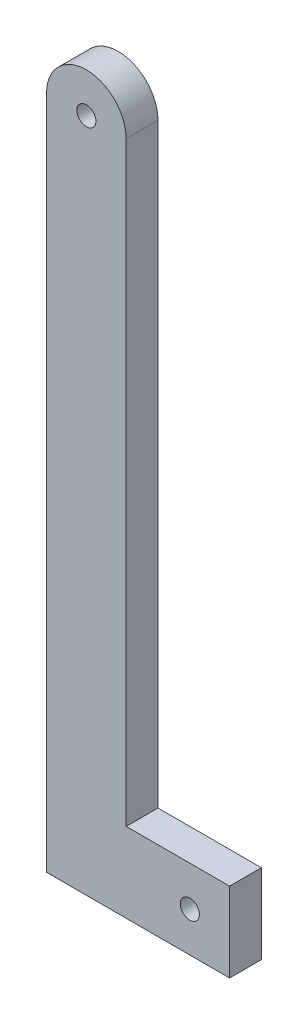
ISO-10303-21;
HEADER;
FILE_DESCRIPTION(('STEP AP214'),'2;1');
FILE_NAME('part.step','',(''),(''),'','','');
FILE_SCHEMA(('AUTOMOTIVE_DESIGN { 1 0 10303 214 1 1 1 1 }'));
ENDSEC;
DATA;
#1=APPLICATION_CONTEXT('core data for automotive mechanical design processes');
#2=APPLICATION_PROTOCOL_DEFINITION('international standard','automotive_design',2000,#1);
#3=PRODUCT_CONTEXT('',#1,'mechanical');
#4=PRODUCT('Part','Part','',(#3));
#5=PRODUCT_RELATED_PRODUCT_CATEGORY('part','',(#4));
#6=PRODUCT_DEFINITION_FORMATION('','',#4);
#7=PRODUCT_DEFINITION_CONTEXT('part definition',#1,'design');
#8=PRODUCT_DEFINITION('design','',#6,#7);
#9=PRODUCT_DEFINITION_SHAPE('','',#8);
#10=(LENGTH_UNIT() NAMED_UNIT(*) SI_UNIT(.MILLI.,.METRE.));
#11=(NAMED_UNIT(*) PLANE_ANGLE_UNIT() SI_UNIT($,.RADIAN.));
#12=(NAMED_UNIT(*) SI_UNIT($,.STERADIAN.) SOLID_ANGLE_UNIT());
#13=UNCERTAINTY_MEASURE_WITH_UNIT(LENGTH_MEASURE(1.E-05),#10,'distance_accuracy_value','');
#14=(GEOMETRIC_REPRESENTATION_CONTEXT(3) GLOBAL_UNCERTAINTY_ASSIGNED_CONTEXT((#13)) GLOBAL_UNIT_ASSIGNED_CONTEXT((#10,
#11,#12)) REPRESENTATION_CONTEXT('',''));
#15=CARTESIAN_POINT('',(0.,0.,0.));
#16=DIRECTION('',(0.,0.,1.));
#17=DIRECTION('',(1.,0.,0.));
#18=AXIS2_PLACEMENT_3D('',#15,#16,#17);
#19=CARTESIAN_POINT('',(0.,0.,10.));
#20=DIRECTION('',(0.,0.,1.));
#21=DIRECTION('',(1.,0.,0.));
#22=AXIS2_PLACEMENT_3D('',#19,#20,#21);
#23=PLANE('',#22);
#24=CARTESIAN_POINT('',(0.,0.,10.));
#25=DIRECTION('',(0.,0.,1.));
#26=DIRECTION('',(1.,0.,0.));
#27=AXIS2_PLACEMENT_3D('',#24,#25,#26);
#28=CIRCLE('',#27,3.);
#29=CARTESIAN_POINT('',(3.,0.,10.));
#30=VERTEX_POINT('',#29);
#31=EDGE_CURVE('E121',#30,#30,#28,.T.);
#32=ORIENTED_EDGE('',*,*,#31,.F.);
#33=EDGE_LOOP('',(#32));
#34=FACE_BOUND('',#33,.T.);
#35=CARTESIAN_POINT('',(0.,0.,10.));
#36=DIRECTION('',(0.,0.,1.));
#37=DIRECTION('',(1.,0.,0.));
#38=AXIS2_PLACEMENT_3D('',#35,#36,#37);
#39=CIRCLE('',#38,12.5);
#40=CARTESIAN_POINT('',(12.5,0.,10.));
#41=VERTEX_POINT('',#40);
#42=CARTESIAN_POINT('',(-12.5,0.,10.));
#43=VERTEX_POINT('',#42);
#44=EDGE_CURVE('E128',#41,#43,#39,.T.);
#45=ORIENTED_EDGE('',*,*,#44,.T.);
#46=DIRECTION('',(0.,-1.,0.));
#47=VECTOR('',#46,1.);
#48=CARTESIAN_POINT('',(-12.5,0.,10.));
#49=LINE('',#48,#47);
#50=CARTESIAN_POINT('',(-12.5,-212.108992783391,10.));
#51=VERTEX_POINT('',#50);
#52=EDGE_CURVE('E86',#43,#51,#49,.T.);
#53=ORIENTED_EDGE('',*,*,#52,.T.);
#54=DIRECTION('',(1.,0.,0.));
#55=VECTOR('',#54,1.);
#56=CARTESIAN_POINT('',(-12.5,-212.108992783391,10.));
#57=LINE('',#56,#55);
#58=CARTESIAN_POINT('',(45.,-212.108992783391,10.));
#59=VERTEX_POINT('',#58);
#60=EDGE_CURVE('E99',#51,#59,#57,.T.);
#61=ORIENTED_EDGE('',*,*,#60,.T.);
#62=DIRECTION('',(0.,1.,0.));
#63=VECTOR('',#62,1.);
#64=CARTESIAN_POINT('',(45.,-212.108992783391,10.));
#65=LINE('',#64,#63);
#66=CARTESIAN_POINT('',(45.,-187.108992783391,10.));
#67=VERTEX_POINT('',#66);
#68=EDGE_CURVE('E93',#59,#67,#65,.T.);
#69=ORIENTED_EDGE('',*,*,#68,.T.);
#70=DIRECTION('',(-1.,0.,0.));
#71=VECTOR('',#70,1.);
#72=CARTESIAN_POINT('',(45.,-187.108992783391,10.));
#73=LINE('',#72,#71);
#74=CARTESIAN_POINT('',(12.5,-187.108992783391,10.));
#75=VERTEX_POINT('',#74);
#76=EDGE_CURVE('E97',#67,#75,#73,.T.);
#77=ORIENTED_EDGE('',*,*,#76,.T.);
#78=DIRECTION('',(0.,1.,0.));
#79=VECTOR('',#78,1.);
#80=CARTESIAN_POINT('',(12.5,0.,10.));
#81=LINE('',#80,#79);
#82=EDGE_CURVE('E49',#75,#41,#81,.T.);
#83=ORIENTED_EDGE('',*,*,#82,.T.);
#84=EDGE_LOOP('',(#45,#53,#61,#69,#77,#83));
#85=FACE_BOUND('',#84,.T.);
#86=CARTESIAN_POINT('',(32.5,-199.608992783391,10.));
#87=DIRECTION('',(0.,0.,1.));
#88=DIRECTION('',(1.,0.,0.));
#89=AXIS2_PLACEMENT_3D('',#86,#87,#88);
#90=CIRCLE('',#89,3.);
#91=CARTESIAN_POINT('',(35.5,-199.608992783391,10.));
#92=VERTEX_POINT('',#91);
#93=EDGE_CURVE('E170',#92,#92,#90,.T.);
#94=ORIENTED_EDGE('',*,*,#93,.F.);
#95=EDGE_LOOP('',(#94));
#96=FACE_BOUND('',#95,.T.);
#97=ADVANCED_FACE('F32',(#34,#85,#96),#23,.T.);
#98=CARTESIAN_POINT('',(0.,0.,0.));
#99=DIRECTION('',(0.,0.,1.));
#100=DIRECTION('',(1.,0.,0.));
#101=AXIS2_PLACEMENT_3D('',#98,#99,#100);
#102=PLANE('',#101);
#103=CARTESIAN_POINT('',(0.,0.,0.));
#104=DIRECTION('',(0.,0.,1.));
#105=DIRECTION('',(1.,0.,0.));
#106=AXIS2_PLACEMENT_3D('',#103,#104,#105);
#107=CIRCLE('',#106,12.5);
#108=CARTESIAN_POINT('',(12.5,0.,0.));
#109=VERTEX_POINT('',#108);
#110=CARTESIAN_POINT('',(-12.5,0.,0.));
#111=VERTEX_POINT('',#110);
#112=EDGE_CURVE('E117',#109,#111,#107,.T.);
#113=ORIENTED_EDGE('',*,*,#112,.F.);
#114=DIRECTION('',(0.,1.,0.));
#115=VECTOR('',#114,1.);
#116=CARTESIAN_POINT('',(12.5,0.,0.));
#117=LINE('',#116,#115);
#118=CARTESIAN_POINT('',(12.5,-187.108992783391,0.));
#119=VERTEX_POINT('',#118);
#120=EDGE_CURVE('E78',#119,#109,#117,.T.);
#121=ORIENTED_EDGE('',*,*,#120,.F.);
#122=DIRECTION('',(-1.,0.,0.));
#123=VECTOR('',#122,1.);
#124=CARTESIAN_POINT('',(45.,-187.108992783391,0.));
#125=LINE('',#124,#123);
#126=CARTESIAN_POINT('',(45.,-187.108992783391,0.));
#127=VERTEX_POINT('',#126);
#128=EDGE_CURVE('E72',#127,#119,#125,.T.);
#129=ORIENTED_EDGE('',*,*,#128,.F.);
#130=DIRECTION('',(0.,1.,0.));
#131=VECTOR('',#130,1.);
#132=CARTESIAN_POINT('',(45.,-212.108992783391,0.));
#133=LINE('',#132,#131);
#134=CARTESIAN_POINT('',(45.,-212.108992783391,0.));
#135=VERTEX_POINT('',#134);
#136=EDGE_CURVE('E107',#135,#127,#133,.T.);
#137=ORIENTED_EDGE('',*,*,#136,.F.);
#138=DIRECTION('',(1.,0.,0.));
#139=VECTOR('',#138,1.);
#140=CARTESIAN_POINT('',(-12.5,-212.108992783391,0.));
#141=LINE('',#140,#139);
#142=CARTESIAN_POINT('',(-12.5,-212.108992783391,0.));
#143=VERTEX_POINT('',#142);
#144=EDGE_CURVE('E123',#143,#135,#141,.T.);
#145=ORIENTED_EDGE('',*,*,#144,.F.);
#146=DIRECTION('',(0.,-1.,0.));
#147=VECTOR('',#146,1.);
#148=CARTESIAN_POINT('',(-12.5,0.,0.));
#149=LINE('',#148,#147);
#150=EDGE_CURVE('E120',#111,#143,#149,.T.);
#151=ORIENTED_EDGE('',*,*,#150,.F.);
#152=EDGE_LOOP('',(#113,#121,#129,#137,#145,#151));
#153=FACE_BOUND('',#152,.T.);
#154=CARTESIAN_POINT('',(0.,0.,0.));
#155=DIRECTION('',(0.,0.,1.));
#156=DIRECTION('',(1.,0.,0.));
#157=AXIS2_PLACEMENT_3D('',#154,#155,#156);
#158=CIRCLE('',#157,3.);
#159=CARTESIAN_POINT('',(3.,0.,0.));
#160=VERTEX_POINT('',#159);
#161=EDGE_CURVE('E176',#160,#160,#158,.T.);
#162=ORIENTED_EDGE('',*,*,#161,.T.);
#163=EDGE_LOOP('',(#162));
#164=FACE_BOUND('',#163,.T.);
#165=CARTESIAN_POINT('',(32.5,-199.608992783391,0.));
#166=DIRECTION('',(0.,0.,1.));
#167=DIRECTION('',(1.,0.,0.));
#168=AXIS2_PLACEMENT_3D('',#165,#166,#167);
#169=CIRCLE('',#168,3.);
#170=CARTESIAN_POINT('',(35.5,-199.608992783391,0.));
#171=VERTEX_POINT('',#170);
#172=EDGE_CURVE('E173',#171,#171,#169,.T.);
#173=ORIENTED_EDGE('',*,*,#172,.T.);
#174=EDGE_LOOP('',(#173));
#175=FACE_BOUND('',#174,.T.);
#176=ADVANCED_FACE('F137',(#153,#164,#175),#102,.F.);
#177=CARTESIAN_POINT('',(0.,0.,10.));
#178=DIRECTION('',(0.,0.,-1.));
#179=DIRECTION('',(-1.,0.,0.));
#180=AXIS2_PLACEMENT_3D('',#177,#178,#179);
#181=CYLINDRICAL_SURFACE('',#180,12.5);
#182=ORIENTED_EDGE('',*,*,#112,.T.);
#183=DIRECTION('',(0.,0.,-1.));
#184=VECTOR('',#183,1.);
#185=CARTESIAN_POINT('',(-12.5,0.,10.));
#186=LINE('',#185,#184);
#187=EDGE_CURVE('E11',#43,#111,#186,.T.);
#188=ORIENTED_EDGE('',*,*,#187,.F.);
#189=ORIENTED_EDGE('',*,*,#44,.F.);
#190=DIRECTION('',(0.,0.,-1.));
#191=VECTOR('',#190,1.);
#192=CARTESIAN_POINT('',(12.5,0.,10.));
#193=LINE('',#192,#191);
#194=EDGE_CURVE('E113',#41,#109,#193,.T.);
#195=ORIENTED_EDGE('',*,*,#194,.T.);
#196=EDGE_LOOP('',(#182,#188,#189,#195));
#197=FACE_BOUND('',#196,.T.);
#198=ADVANCED_FACE('F34',(#197),#181,.T.);
#199=CARTESIAN_POINT('',(-12.5,0.,10.));
#200=DIRECTION('',(1.,0.,0.));
#201=DIRECTION('',(0.,1.,0.));
#202=AXIS2_PLACEMENT_3D('',#199,#200,#201);
#203=PLANE('',#202);
#204=ORIENTED_EDGE('',*,*,#150,.T.);
#205=DIRECTION('',(0.,0.,-1.));
#206=VECTOR('',#205,1.);
#207=CARTESIAN_POINT('',(-12.5,-212.108992783391,10.));
#208=LINE('',#207,#206);
#209=EDGE_CURVE('E41',#51,#143,#208,.T.);
#210=ORIENTED_EDGE('',*,*,#209,.F.);
#211=ORIENTED_EDGE('',*,*,#52,.F.);
#212=ORIENTED_EDGE('',*,*,#187,.T.);
#213=EDGE_LOOP('',(#204,#210,#211,#212));
#214=FACE_BOUND('',#213,.T.);
#215=ADVANCED_FACE('F217',(#214),#203,.F.);
#216=CARTESIAN_POINT('',(-12.5,-212.108992783391,10.));
#217=DIRECTION('',(0.,1.,0.));
#218=DIRECTION('',(0.,0.,1.));
#219=AXIS2_PLACEMENT_3D('',#216,#217,#218);
#220=PLANE('',#219);
#221=ORIENTED_EDGE('',*,*,#144,.T.);
#222=DIRECTION('',(0.,0.,-1.));
#223=VECTOR('',#222,1.);
#224=CARTESIAN_POINT('',(45.,-212.108992783391,10.));
#225=LINE('',#224,#223);
#226=EDGE_CURVE('E108',#59,#135,#225,.T.);
#227=ORIENTED_EDGE('',*,*,#226,.F.);
#228=ORIENTED_EDGE('',*,*,#60,.F.);
#229=ORIENTED_EDGE('',*,*,#209,.T.);
#230=EDGE_LOOP('',(#221,#227,#228,#229));
#231=FACE_BOUND('',#230,.T.);
#232=ADVANCED_FACE('F134',(#231),#220,.F.);
#233=CARTESIAN_POINT('',(45.,-212.108992783391,10.));
#234=DIRECTION('',(-1.,0.,0.));
#235=DIRECTION('',(0.,0.,1.));
#236=AXIS2_PLACEMENT_3D('',#233,#234,#235);
#237=PLANE('',#236);
#238=ORIENTED_EDGE('',*,*,#136,.T.);
#239=DIRECTION('',(0.,0.,-1.));
#240=VECTOR('',#239,1.);
#241=CARTESIAN_POINT('',(45.,-187.108992783391,10.));
#242=LINE('',#241,#240);
#243=EDGE_CURVE('E104',#67,#127,#242,.T.);
#244=ORIENTED_EDGE('',*,*,#243,.F.);
#245=ORIENTED_EDGE('',*,*,#68,.F.);
#246=ORIENTED_EDGE('',*,*,#226,.T.);
#247=EDGE_LOOP('',(#238,#244,#245,#246));
#248=FACE_BOUND('',#247,.T.);
#249=ADVANCED_FACE('F105',(#248),#237,.F.);
#250=CARTESIAN_POINT('',(45.,-187.108992783391,10.));
#251=DIRECTION('',(0.,-1.,0.));
#252=DIRECTION('',(0.,0.,-1.));
#253=AXIS2_PLACEMENT_3D('',#250,#251,#252);
#254=PLANE('',#253);
#255=ORIENTED_EDGE('',*,*,#128,.T.);
#256=DIRECTION('',(0.,0.,-1.));
#257=VECTOR('',#256,1.);
#258=CARTESIAN_POINT('',(12.5,-187.108992783391,10.));
#259=LINE('',#258,#257);
#260=EDGE_CURVE('E109',#75,#119,#259,.T.);
#261=ORIENTED_EDGE('',*,*,#260,.F.);
#262=ORIENTED_EDGE('',*,*,#76,.F.);
#263=ORIENTED_EDGE('',*,*,#243,.T.);
#264=EDGE_LOOP('',(#255,#261,#262,#263));
#265=FACE_BOUND('',#264,.T.);
#266=ADVANCED_FACE('F111',(#265),#254,.F.);
#267=CARTESIAN_POINT('',(12.5,0.,10.));
#268=DIRECTION('',(-1.,0.,0.));
#269=DIRECTION('',(0.,0.,1.));
#270=AXIS2_PLACEMENT_3D('',#267,#268,#269);
#271=PLANE('',#270);
#272=ORIENTED_EDGE('',*,*,#120,.T.);
#273=ORIENTED_EDGE('',*,*,#194,.F.);
#274=ORIENTED_EDGE('',*,*,#82,.F.);
#275=ORIENTED_EDGE('',*,*,#260,.T.);
#276=EDGE_LOOP('',(#272,#273,#274,#275));
#277=FACE_BOUND('',#276,.T.);
#278=ADVANCED_FACE('F142',(#277),#271,.F.);
#279=CARTESIAN_POINT('',(0.,0.,10.));
#280=DIRECTION('',(0.,0.,-1.));
#281=DIRECTION('',(-1.,0.,0.));
#282=AXIS2_PLACEMENT_3D('',#279,#280,#281);
#283=CYLINDRICAL_SURFACE('',#282,3.);
#284=ORIENTED_EDGE('',*,*,#31,.T.);
#285=EDGE_LOOP('',(#284));
#286=FACE_BOUND('',#285,.T.);
#287=ORIENTED_EDGE('',*,*,#161,.F.);
#288=EDGE_LOOP('',(#287));
#289=FACE_BOUND('',#288,.T.);
#290=ADVANCED_FACE('F144',(#286,#289),#283,.F.);
#291=CARTESIAN_POINT('',(32.5,-199.608992783391,10.));
#292=DIRECTION('',(0.,0.,-1.));
#293=DIRECTION('',(-1.,0.,0.));
#294=AXIS2_PLACEMENT_3D('',#291,#292,#293);
#295=CYLINDRICAL_SURFACE('',#294,3.);
#296=ORIENTED_EDGE('',*,*,#93,.T.);
#297=EDGE_LOOP('',(#296));
#298=FACE_BOUND('',#297,.T.);
#299=ORIENTED_EDGE('',*,*,#172,.F.);
#300=EDGE_LOOP('',(#299));
#301=FACE_BOUND('',#300,.T.);
#302=ADVANCED_FACE('F150',(#298,#301),#295,.F.);
#303=CLOSED_SHELL('',(#97,#176,#198,#215,#232,#249,#266,#278,#290,#302));
#304=MANIFOLD_SOLID_BREP('B2',#303);
#305=ADVANCED_BREP_SHAPE_REPRESENTATION('',(#18,#304),#14);
#306=SHAPE_DEFINITION_REPRESENTATION(#9,#305);
ENDSEC;
END-ISO-10303-21;
